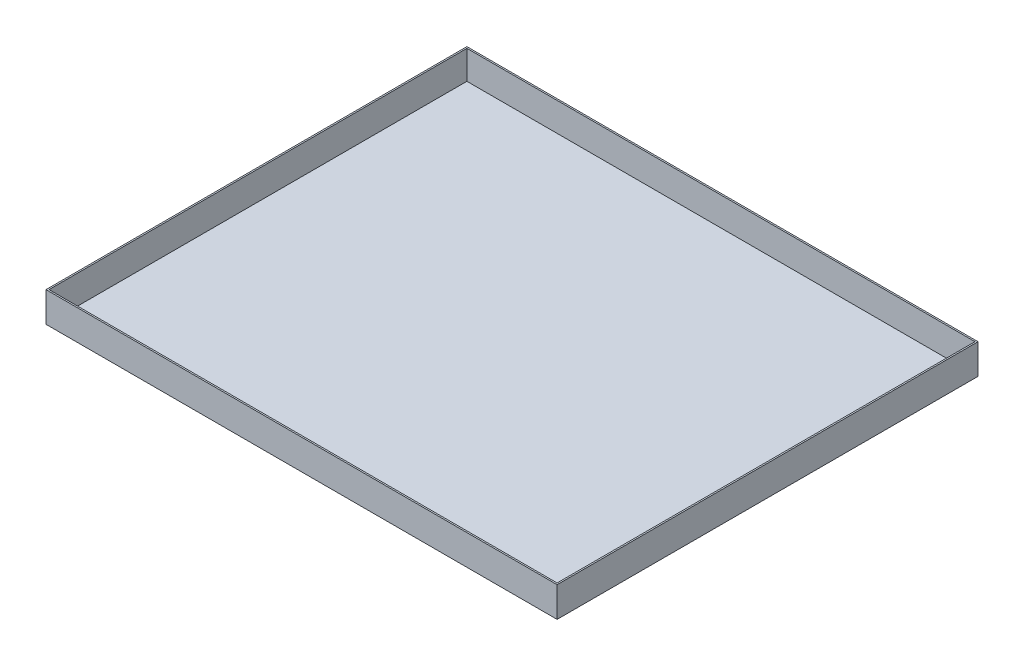
ISO-10303-21;
HEADER;
FILE_DESCRIPTION(('STEP AP214'),'2;1');
FILE_NAME('part.step','',(''),(''),'','','');
FILE_SCHEMA(('AUTOMOTIVE_DESIGN { 1 0 10303 214 1 1 1 1 }'));
ENDSEC;
DATA;
#1=APPLICATION_CONTEXT('core data for automotive mechanical design processes');
#2=APPLICATION_PROTOCOL_DEFINITION('international standard','automotive_design',2000,#1);
#3=PRODUCT_CONTEXT('',#1,'mechanical');
#4=PRODUCT('Part','Part','',(#3));
#5=PRODUCT_RELATED_PRODUCT_CATEGORY('part','',(#4));
#6=PRODUCT_DEFINITION_FORMATION('','',#4);
#7=PRODUCT_DEFINITION_CONTEXT('part definition',#1,'design');
#8=PRODUCT_DEFINITION('design','',#6,#7);
#9=PRODUCT_DEFINITION_SHAPE('','',#8);
#10=(LENGTH_UNIT() NAMED_UNIT(*) SI_UNIT(.MILLI.,.METRE.));
#11=(NAMED_UNIT(*) PLANE_ANGLE_UNIT() SI_UNIT($,.RADIAN.));
#12=(NAMED_UNIT(*) SI_UNIT($,.STERADIAN.) SOLID_ANGLE_UNIT());
#13=UNCERTAINTY_MEASURE_WITH_UNIT(LENGTH_MEASURE(1.E-05),#10,'distance_accuracy_value','');
#14=(GEOMETRIC_REPRESENTATION_CONTEXT(3) GLOBAL_UNCERTAINTY_ASSIGNED_CONTEXT((#13)) GLOBAL_UNIT_ASSIGNED_CONTEXT((#10,
#11,#12)) REPRESENTATION_CONTEXT('',''));
#15=CARTESIAN_POINT('',(0.,0.,0.));
#16=DIRECTION('',(0.,0.,1.));
#17=DIRECTION('',(1.,0.,0.));
#18=AXIS2_PLACEMENT_3D('',#15,#16,#17);
#19=CARTESIAN_POINT('',(-85.,10.,-70.));
#20=DIRECTION('',(0.,0.,-1.));
#21=DIRECTION('',(-1.,0.,0.));
#22=AXIS2_PLACEMENT_3D('',#19,#20,#21);
#23=PLANE('',#22);
#24=DIRECTION('',(1.,0.,0.));
#25=VECTOR('',#24,1.);
#26=CARTESIAN_POINT('',(-85.,0.,-70.));
#27=LINE('',#26,#25);
#28=CARTESIAN_POINT('',(-85.,0.,-70.));
#29=VERTEX_POINT('',#28);
#30=CARTESIAN_POINT('',(85.,0.,-70.));
#31=VERTEX_POINT('',#30);
#32=EDGE_CURVE('E118',#29,#31,#27,.T.);
#33=ORIENTED_EDGE('',*,*,#32,.F.);
#34=DIRECTION('',(0.,-1.,0.));
#35=VECTOR('',#34,1.);
#36=CARTESIAN_POINT('',(-85.,10.,-70.));
#37=LINE('',#36,#35);
#38=CARTESIAN_POINT('',(-85.,10.,-70.));
#39=VERTEX_POINT('',#38);
#40=EDGE_CURVE('E11',#39,#29,#37,.T.);
#41=ORIENTED_EDGE('',*,*,#40,.F.);
#42=DIRECTION('',(1.,0.,0.));
#43=VECTOR('',#42,1.);
#44=CARTESIAN_POINT('',(-85.,10.,-70.));
#45=LINE('',#44,#43);
#46=CARTESIAN_POINT('',(85.,10.,-70.));
#47=VERTEX_POINT('',#46);
#48=EDGE_CURVE('E149',#39,#47,#45,.T.);
#49=ORIENTED_EDGE('',*,*,#48,.T.);
#50=DIRECTION('',(0.,-1.,0.));
#51=VECTOR('',#50,1.);
#52=CARTESIAN_POINT('',(85.,10.,-70.));
#53=LINE('',#52,#51);
#54=EDGE_CURVE('E40',#47,#31,#53,.T.);
#55=ORIENTED_EDGE('',*,*,#54,.T.);
#56=EDGE_LOOP('',(#33,#41,#49,#55));
#57=FACE_BOUND('',#56,.T.);
#58=ADVANCED_FACE('F37',(#57),#23,.T.);
#59=CARTESIAN_POINT('',(-85.,10.,-70.));
#60=DIRECTION('',(1.,0.,0.));
#61=DIRECTION('',(0.,0.,-1.));
#62=AXIS2_PLACEMENT_3D('',#59,#60,#61);
#63=PLANE('',#62);
#64=DIRECTION('',(0.,0.,1.));
#65=VECTOR('',#64,1.);
#66=CARTESIAN_POINT('',(-85.,0.,-70.));
#67=LINE('',#66,#65);
#68=CARTESIAN_POINT('',(-85.,0.,70.));
#69=VERTEX_POINT('',#68);
#70=EDGE_CURVE('E152',#29,#69,#67,.T.);
#71=ORIENTED_EDGE('',*,*,#70,.T.);
#72=DIRECTION('',(0.,-1.,0.));
#73=VECTOR('',#72,1.);
#74=CARTESIAN_POINT('',(-85.,10.,70.));
#75=LINE('',#74,#73);
#76=CARTESIAN_POINT('',(-85.,10.,70.));
#77=VERTEX_POINT('',#76);
#78=EDGE_CURVE('E45',#77,#69,#75,.T.);
#79=ORIENTED_EDGE('',*,*,#78,.F.);
#80=DIRECTION('',(0.,0.,1.));
#81=VECTOR('',#80,1.);
#82=CARTESIAN_POINT('',(-85.,10.,-70.));
#83=LINE('',#82,#81);
#84=EDGE_CURVE('E156',#39,#77,#83,.T.);
#85=ORIENTED_EDGE('',*,*,#84,.F.);
#86=ORIENTED_EDGE('',*,*,#40,.T.);
#87=EDGE_LOOP('',(#71,#79,#85,#86));
#88=FACE_BOUND('',#87,.T.);
#89=ADVANCED_FACE('F176',(#88),#63,.F.);
#90=CARTESIAN_POINT('',(-85.,10.,70.));
#91=DIRECTION('',(0.,0.,-1.));
#92=DIRECTION('',(-1.,0.,0.));
#93=AXIS2_PLACEMENT_3D('',#90,#91,#92);
#94=PLANE('',#93);
#95=DIRECTION('',(1.,0.,0.));
#96=VECTOR('',#95,1.);
#97=CARTESIAN_POINT('',(-85.,0.,70.));
#98=LINE('',#97,#96);
#99=CARTESIAN_POINT('',(85.,0.,70.));
#100=VERTEX_POINT('',#99);
#101=EDGE_CURVE('E163',#69,#100,#98,.T.);
#102=ORIENTED_EDGE('',*,*,#101,.T.);
#103=DIRECTION('',(0.,-1.,0.));
#104=VECTOR('',#103,1.);
#105=CARTESIAN_POINT('',(85.,10.,70.));
#106=LINE('',#105,#104);
#107=CARTESIAN_POINT('',(85.,10.,70.));
#108=VERTEX_POINT('',#107);
#109=EDGE_CURVE('E168',#108,#100,#106,.T.);
#110=ORIENTED_EDGE('',*,*,#109,.F.);
#111=DIRECTION('',(1.,0.,0.));
#112=VECTOR('',#111,1.);
#113=CARTESIAN_POINT('',(-85.,10.,70.));
#114=LINE('',#113,#112);
#115=EDGE_CURVE('E154',#77,#108,#114,.T.);
#116=ORIENTED_EDGE('',*,*,#115,.F.);
#117=ORIENTED_EDGE('',*,*,#78,.T.);
#118=EDGE_LOOP('',(#102,#110,#116,#117));
#119=FACE_BOUND('',#118,.T.);
#120=ADVANCED_FACE('F179',(#119),#94,.F.);
#121=CARTESIAN_POINT('',(85.,10.,-70.));
#122=DIRECTION('',(1.,0.,0.));
#123=DIRECTION('',(0.,0.,-1.));
#124=AXIS2_PLACEMENT_3D('',#121,#122,#123);
#125=PLANE('',#124);
#126=DIRECTION('',(0.,0.,1.));
#127=VECTOR('',#126,1.);
#128=CARTESIAN_POINT('',(85.,0.,-70.));
#129=LINE('',#128,#127);
#130=EDGE_CURVE('E160',#31,#100,#129,.T.);
#131=ORIENTED_EDGE('',*,*,#130,.F.);
#132=ORIENTED_EDGE('',*,*,#54,.F.);
#133=DIRECTION('',(0.,0.,1.));
#134=VECTOR('',#133,1.);
#135=CARTESIAN_POINT('',(85.,10.,-70.));
#136=LINE('',#135,#134);
#137=EDGE_CURVE('E151',#47,#108,#136,.T.);
#138=ORIENTED_EDGE('',*,*,#137,.T.);
#139=ORIENTED_EDGE('',*,*,#109,.T.);
#140=EDGE_LOOP('',(#131,#132,#138,#139));
#141=FACE_BOUND('',#140,.T.);
#142=ADVANCED_FACE('F171',(#141),#125,.T.);
#143=CARTESIAN_POINT('',(0.,10.,0.));
#144=DIRECTION('',(0.,-1.,0.));
#145=DIRECTION('',(0.,0.,-1.));
#146=AXIS2_PLACEMENT_3D('',#143,#144,#145);
#147=PLANE('',#146);
#148=DIRECTION('',(0.,0.,1.));
#149=VECTOR('',#148,1.);
#150=CARTESIAN_POINT('',(-84.5,10.,0.));
#151=LINE('',#150,#149);
#152=CARTESIAN_POINT('',(-84.5,10.,-69.5));
#153=VERTEX_POINT('',#152);
#154=CARTESIAN_POINT('',(-84.5,10.,69.5));
#155=VERTEX_POINT('',#154);
#156=EDGE_CURVE('E137',#153,#155,#151,.T.);
#157=ORIENTED_EDGE('',*,*,#156,.F.);
#158=DIRECTION('',(1.,0.,0.));
#159=VECTOR('',#158,1.);
#160=CARTESIAN_POINT('',(0.,10.,-69.5));
#161=LINE('',#160,#159);
#162=CARTESIAN_POINT('',(84.5,10.,-69.5));
#163=VERTEX_POINT('',#162);
#164=EDGE_CURVE('E115',#153,#163,#161,.T.);
#165=ORIENTED_EDGE('',*,*,#164,.T.);
#166=DIRECTION('',(0.,0.,1.));
#167=VECTOR('',#166,1.);
#168=CARTESIAN_POINT('',(84.5,10.,0.));
#169=LINE('',#168,#167);
#170=CARTESIAN_POINT('',(84.5,10.,69.5));
#171=VERTEX_POINT('',#170);
#172=EDGE_CURVE('E143',#163,#171,#169,.T.);
#173=ORIENTED_EDGE('',*,*,#172,.T.);
#174=DIRECTION('',(1.,0.,0.));
#175=VECTOR('',#174,1.);
#176=CARTESIAN_POINT('',(0.,10.,69.5));
#177=LINE('',#176,#175);
#178=EDGE_CURVE('E145',#155,#171,#177,.T.);
#179=ORIENTED_EDGE('',*,*,#178,.F.);
#180=EDGE_LOOP('',(#157,#165,#173,#179));
#181=FACE_BOUND('',#180,.T.);
#182=ORIENTED_EDGE('',*,*,#48,.F.);
#183=ORIENTED_EDGE('',*,*,#84,.T.);
#184=ORIENTED_EDGE('',*,*,#115,.T.);
#185=ORIENTED_EDGE('',*,*,#137,.F.);
#186=EDGE_LOOP('',(#182,#183,#184,#185));
#187=FACE_BOUND('',#186,.T.);
#188=ADVANCED_FACE('F181',(#181,#187),#147,.F.);
#189=CARTESIAN_POINT('',(0.,0.,0.));
#190=DIRECTION('',(0.,-1.,0.));
#191=DIRECTION('',(0.,0.,-1.));
#192=AXIS2_PLACEMENT_3D('',#189,#190,#191);
#193=PLANE('',#192);
#194=ORIENTED_EDGE('',*,*,#32,.T.);
#195=ORIENTED_EDGE('',*,*,#130,.T.);
#196=ORIENTED_EDGE('',*,*,#101,.F.);
#197=ORIENTED_EDGE('',*,*,#70,.F.);
#198=EDGE_LOOP('',(#194,#195,#196,#197));
#199=FACE_BOUND('',#198,.T.);
#200=ADVANCED_FACE('F174',(#199),#193,.T.);
#201=CARTESIAN_POINT('',(-85.,10.,-69.5));
#202=DIRECTION('',(0.,0.,-1.));
#203=DIRECTION('',(-1.,0.,0.));
#204=AXIS2_PLACEMENT_3D('',#201,#202,#203);
#205=PLANE('',#204);
#206=DIRECTION('',(1.,0.,0.));
#207=VECTOR('',#206,1.);
#208=CARTESIAN_POINT('',(0.,0.5,-69.5));
#209=LINE('',#208,#207);
#210=CARTESIAN_POINT('',(-84.5,0.5,-69.5));
#211=VERTEX_POINT('',#210);
#212=CARTESIAN_POINT('',(84.5,0.5,-69.5));
#213=VERTEX_POINT('',#212);
#214=EDGE_CURVE('E113',#211,#213,#209,.T.);
#215=ORIENTED_EDGE('',*,*,#214,.T.);
#216=DIRECTION('',(0.,-1.,0.));
#217=VECTOR('',#216,1.);
#218=CARTESIAN_POINT('',(84.5,10.,-69.5));
#219=LINE('',#218,#217);
#220=EDGE_CURVE('E136',#163,#213,#219,.T.);
#221=ORIENTED_EDGE('',*,*,#220,.F.);
#222=ORIENTED_EDGE('',*,*,#164,.F.);
#223=DIRECTION('',(0.,-1.,0.));
#224=VECTOR('',#223,1.);
#225=CARTESIAN_POINT('',(-84.5,10.,-69.5));
#226=LINE('',#225,#224);
#227=EDGE_CURVE('E109',#153,#211,#226,.T.);
#228=ORIENTED_EDGE('',*,*,#227,.T.);
#229=EDGE_LOOP('',(#215,#221,#222,#228));
#230=FACE_BOUND('',#229,.T.);
#231=ADVANCED_FACE('F111',(#230),#205,.F.);
#232=CARTESIAN_POINT('',(-84.5,10.,-70.));
#233=DIRECTION('',(1.,0.,0.));
#234=DIRECTION('',(0.,0.,-1.));
#235=AXIS2_PLACEMENT_3D('',#232,#233,#234);
#236=PLANE('',#235);
#237=DIRECTION('',(0.,0.,1.));
#238=VECTOR('',#237,1.);
#239=CARTESIAN_POINT('',(-84.5,0.5,0.));
#240=LINE('',#239,#238);
#241=CARTESIAN_POINT('',(-84.5,0.5,69.5));
#242=VERTEX_POINT('',#241);
#243=EDGE_CURVE('E122',#211,#242,#240,.T.);
#244=ORIENTED_EDGE('',*,*,#243,.F.);
#245=ORIENTED_EDGE('',*,*,#227,.F.);
#246=ORIENTED_EDGE('',*,*,#156,.T.);
#247=DIRECTION('',(0.,-1.,0.));
#248=VECTOR('',#247,1.);
#249=CARTESIAN_POINT('',(-84.5,10.,69.5));
#250=LINE('',#249,#248);
#251=EDGE_CURVE('E119',#155,#242,#250,.T.);
#252=ORIENTED_EDGE('',*,*,#251,.T.);
#253=EDGE_LOOP('',(#244,#245,#246,#252));
#254=FACE_BOUND('',#253,.T.);
#255=ADVANCED_FACE('F123',(#254),#236,.T.);
#256=CARTESIAN_POINT('',(-85.,10.,69.5));
#257=DIRECTION('',(0.,0.,-1.));
#258=DIRECTION('',(-1.,0.,0.));
#259=AXIS2_PLACEMENT_3D('',#256,#257,#258);
#260=PLANE('',#259);
#261=DIRECTION('',(1.,0.,0.));
#262=VECTOR('',#261,1.);
#263=CARTESIAN_POINT('',(0.,0.5,69.5));
#264=LINE('',#263,#262);
#265=CARTESIAN_POINT('',(84.5,0.5,69.5));
#266=VERTEX_POINT('',#265);
#267=EDGE_CURVE('E128',#242,#266,#264,.T.);
#268=ORIENTED_EDGE('',*,*,#267,.F.);
#269=ORIENTED_EDGE('',*,*,#251,.F.);
#270=ORIENTED_EDGE('',*,*,#178,.T.);
#271=DIRECTION('',(0.,-1.,0.));
#272=VECTOR('',#271,1.);
#273=CARTESIAN_POINT('',(84.5,10.,69.5));
#274=LINE('',#273,#272);
#275=EDGE_CURVE('E53',#171,#266,#274,.T.);
#276=ORIENTED_EDGE('',*,*,#275,.T.);
#277=EDGE_LOOP('',(#268,#269,#270,#276));
#278=FACE_BOUND('',#277,.T.);
#279=ADVANCED_FACE('F228',(#278),#260,.T.);
#280=CARTESIAN_POINT('',(84.5,10.,-70.));
#281=DIRECTION('',(1.,0.,0.));
#282=DIRECTION('',(0.,0.,-1.));
#283=AXIS2_PLACEMENT_3D('',#280,#281,#282);
#284=PLANE('',#283);
#285=DIRECTION('',(0.,0.,1.));
#286=VECTOR('',#285,1.);
#287=CARTESIAN_POINT('',(84.5,0.5,0.));
#288=LINE('',#287,#286);
#289=EDGE_CURVE('E132',#213,#266,#288,.T.);
#290=ORIENTED_EDGE('',*,*,#289,.T.);
#291=ORIENTED_EDGE('',*,*,#275,.F.);
#292=ORIENTED_EDGE('',*,*,#172,.F.);
#293=ORIENTED_EDGE('',*,*,#220,.T.);
#294=EDGE_LOOP('',(#290,#291,#292,#293));
#295=FACE_BOUND('',#294,.T.);
#296=ADVANCED_FACE('F236',(#295),#284,.F.);
#297=CARTESIAN_POINT('',(0.,0.5,0.));
#298=DIRECTION('',(0.,-1.,0.));
#299=DIRECTION('',(0.,0.,-1.));
#300=AXIS2_PLACEMENT_3D('',#297,#298,#299);
#301=PLANE('',#300);
#302=ORIENTED_EDGE('',*,*,#214,.F.);
#303=ORIENTED_EDGE('',*,*,#243,.T.);
#304=ORIENTED_EDGE('',*,*,#267,.T.);
#305=ORIENTED_EDGE('',*,*,#289,.F.);
#306=EDGE_LOOP('',(#302,#303,#304,#305));
#307=FACE_BOUND('',#306,.T.);
#308=ADVANCED_FACE('F131',(#307),#301,.F.);
#309=CLOSED_SHELL('',(#58,#89,#120,#142,#188,#200,#231,#255,#279,#296,#308));
#310=MANIFOLD_SOLID_BREP('B2',#309);
#311=ADVANCED_BREP_SHAPE_REPRESENTATION('',(#18,#310),#14);
#312=SHAPE_DEFINITION_REPRESENTATION(#9,#311);
ENDSEC;
END-ISO-10303-21;
